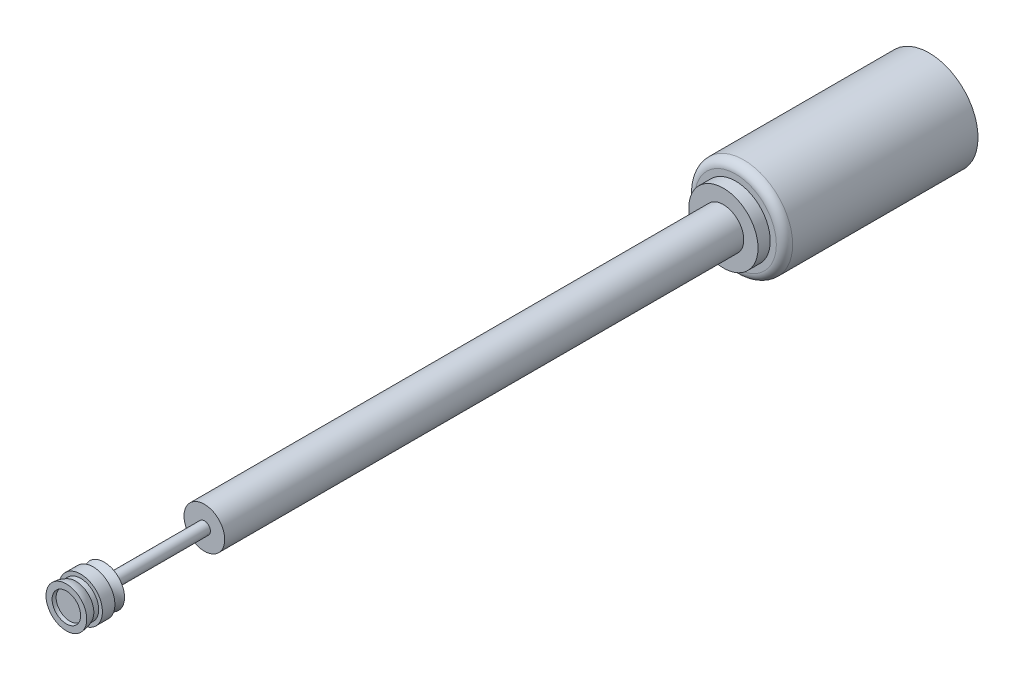
ISO-10303-21;
HEADER;
FILE_DESCRIPTION(('STEP AP214'),'2;1');
FILE_NAME('part.step','',(''),(''),'','','');
FILE_SCHEMA(('AUTOMOTIVE_DESIGN { 1 0 10303 214 1 1 1 1 }'));
ENDSEC;
DATA;
#1=APPLICATION_CONTEXT('core data for automotive mechanical design processes');
#2=APPLICATION_PROTOCOL_DEFINITION('international standard','automotive_design',2000,#1);
#3=PRODUCT_CONTEXT('',#1,'mechanical');
#4=PRODUCT('Part','Part','',(#3));
#5=PRODUCT_RELATED_PRODUCT_CATEGORY('part','',(#4));
#6=PRODUCT_DEFINITION_FORMATION('','',#4);
#7=PRODUCT_DEFINITION_CONTEXT('part definition',#1,'design');
#8=PRODUCT_DEFINITION('design','',#6,#7);
#9=PRODUCT_DEFINITION_SHAPE('','',#8);
#10=(LENGTH_UNIT() NAMED_UNIT(*) SI_UNIT(.MILLI.,.METRE.));
#11=(NAMED_UNIT(*) PLANE_ANGLE_UNIT() SI_UNIT($,.RADIAN.));
#12=(NAMED_UNIT(*) SI_UNIT($,.STERADIAN.) SOLID_ANGLE_UNIT());
#13=UNCERTAINTY_MEASURE_WITH_UNIT(LENGTH_MEASURE(1.E-05),#10,'distance_accuracy_value','');
#14=(GEOMETRIC_REPRESENTATION_CONTEXT(3) GLOBAL_UNCERTAINTY_ASSIGNED_CONTEXT((#13)) GLOBAL_UNIT_ASSIGNED_CONTEXT((#10,
#11,#12)) REPRESENTATION_CONTEXT('',''));
#15=CARTESIAN_POINT('',(0.,0.,0.));
#16=DIRECTION('',(0.,0.,1.));
#17=DIRECTION('',(1.,0.,0.));
#18=AXIS2_PLACEMENT_3D('',#15,#16,#17);
#19=CARTESIAN_POINT('',(0.,0.,16.4275));
#20=DIRECTION('',(0.,0.,-1.));
#21=DIRECTION('',(-1.,0.,0.));
#22=AXIS2_PLACEMENT_3D('',#19,#20,#21);
#23=SPHERICAL_SURFACE('',#22,0.35);
#24=CARTESIAN_POINT('',(0.,0.,16.4275));
#25=DIRECTION('',(0.,0.,-1.));
#26=DIRECTION('',(-1.,0.,0.));
#27=AXIS2_PLACEMENT_3D('',#24,#25,#26);
#28=CIRCLE('',#27,0.35);
#29=CARTESIAN_POINT('',(-0.35,0.,16.4275));
#30=VERTEX_POINT('',#29);
#31=EDGE_CURVE('E87',#30,#30,#28,.T.);
#32=ORIENTED_EDGE('',*,*,#31,.F.);
#33=EDGE_LOOP('',(#32));
#34=FACE_BOUND('',#33,.T.);
#35=CARTESIAN_POINT('',(0.,0.,16.34));
#36=DIRECTION('',(0.,0.,-1.));
#37=DIRECTION('',(-1.,0.,0.));
#38=AXIS2_PLACEMENT_3D('',#35,#36,#37);
#39=CIRCLE('',#38,0.338886042793149);
#40=CARTESIAN_POINT('',(-0.338886042793149,0.,16.34));
#41=VERTEX_POINT('',#40);
#42=EDGE_CURVE('E10',#41,#41,#39,.F.);
#43=ORIENTED_EDGE('',*,*,#42,.F.);
#44=EDGE_LOOP('',(#43));
#45=FACE_BOUND('',#44,.T.);
#46=ADVANCED_FACE('F36',(#34,#45),#23,.F.);
#47=CARTESIAN_POINT('',(0.,0.,15.7709864840342));
#48=DIRECTION('',(0.,0.,-1.));
#49=DIRECTION('',(-1.,0.,0.));
#50=AXIS2_PLACEMENT_3D('',#47,#48,#49);
#51=TOROIDAL_SURFACE('',#50,0.772327550302638,0.384182208311404);
#52=CARTESIAN_POINT('',(0.,0.,15.5));
#53=DIRECTION('',(0.,0.,1.));
#54=DIRECTION('',(1.,0.,0.));
#55=AXIS2_PLACEMENT_3D('',#52,#53,#54);
#56=CIRCLE('',#55,0.499999999999999);
#57=CARTESIAN_POINT('',(0.499999999999999,0.,15.5));
#58=VERTEX_POINT('',#57);
#59=EDGE_CURVE('E90',#58,#58,#56,.F.);
#60=ORIENTED_EDGE('',*,*,#59,.F.);
#61=EDGE_LOOP('',(#60));
#62=FACE_BOUND('',#61,.T.);
#63=CARTESIAN_POINT('',(0.,0.,15.7709864840342));
#64=DIRECTION('',(0.,0.,-1.));
#65=DIRECTION('',(-1.,0.,0.));
#66=AXIS2_PLACEMENT_3D('',#63,#64,#65);
#67=CIRCLE('',#66,0.388145341991233);
#68=CARTESIAN_POINT('',(-0.388145341991233,0.,15.7709864840342));
#69=VERTEX_POINT('',#68);
#70=EDGE_CURVE('E69',#69,#69,#67,.T.);
#71=ORIENTED_EDGE('',*,*,#70,.T.);
#72=EDGE_LOOP('',(#71));
#73=FACE_BOUND('',#72,.T.);
#74=ADVANCED_FACE('F120',(#62,#73),#51,.F.);
#75=CARTESIAN_POINT('',(0.535097448690288,0.,15.7709864840342));
#76=DIRECTION('',(0.,0.,1.));
#77=DIRECTION('',(1.,0.,0.));
#78=AXIS2_PLACEMENT_3D('',#75,#76,#77);
#79=PLANE('',#78);
#80=ORIENTED_EDGE('',*,*,#70,.F.);
#81=EDGE_LOOP('',(#80));
#82=FACE_BOUND('',#81,.T.);
#83=CARTESIAN_POINT('',(0.,0.,15.7709864840342));
#84=DIRECTION('',(0.,0.,-1.));
#85=DIRECTION('',(-1.,0.,0.));
#86=AXIS2_PLACEMENT_3D('',#83,#84,#85);
#87=CIRCLE('',#86,0.535097448690288);
#88=CARTESIAN_POINT('',(-0.535097448690288,0.,15.7709864840342));
#89=VERTEX_POINT('',#88);
#90=EDGE_CURVE('E72',#89,#89,#87,.T.);
#91=ORIENTED_EDGE('',*,*,#90,.T.);
#92=EDGE_LOOP('',(#91));
#93=FACE_BOUND('',#92,.T.);
#94=ADVANCED_FACE('F127',(#82,#93),#79,.F.);
#95=CARTESIAN_POINT('',(0.,0.,15.5));
#96=DIRECTION('',(0.,0.,-1.));
#97=DIRECTION('',(-1.,0.,0.));
#98=AXIS2_PLACEMENT_3D('',#95,#96,#97);
#99=CYLINDRICAL_SURFACE('',#98,0.535097448690288);
#100=ORIENTED_EDGE('',*,*,#90,.F.);
#101=EDGE_LOOP('',(#100));
#102=FACE_BOUND('',#101,.T.);
#103=CARTESIAN_POINT('',(0.,0.,16.0775));
#104=DIRECTION('',(0.,0.,-1.));
#105=DIRECTION('',(-1.,0.,0.));
#106=AXIS2_PLACEMENT_3D('',#103,#104,#105);
#107=CIRCLE('',#106,0.535097448690288);
#108=CARTESIAN_POINT('',(-0.535097448690287,0.,16.0775));
#109=VERTEX_POINT('',#108);
#110=EDGE_CURVE('E75',#109,#109,#107,.T.);
#111=ORIENTED_EDGE('',*,*,#110,.T.);
#112=EDGE_LOOP('',(#111));
#113=FACE_BOUND('',#112,.T.);
#114=ADVANCED_FACE('F171',(#102,#113),#99,.T.);
#115=CARTESIAN_POINT('',(0.443589461196576,0.,16.0775));
#116=DIRECTION('',(0.,0.,-1.));
#117=DIRECTION('',(-1.,0.,0.));
#118=AXIS2_PLACEMENT_3D('',#115,#116,#117);
#119=PLANE('',#118);
#120=ORIENTED_EDGE('',*,*,#110,.F.);
#121=EDGE_LOOP('',(#120));
#122=FACE_BOUND('',#121,.T.);
#123=CARTESIAN_POINT('',(0.,0.,16.0775));
#124=DIRECTION('',(0.,0.,-1.));
#125=DIRECTION('',(-1.,0.,0.));
#126=AXIS2_PLACEMENT_3D('',#123,#124,#125);
#127=CIRCLE('',#126,0.443589461196576);
#128=CARTESIAN_POINT('',(-0.443589461196576,0.,16.0775));
#129=VERTEX_POINT('',#128);
#130=EDGE_CURVE('E78',#129,#129,#127,.T.);
#131=ORIENTED_EDGE('',*,*,#130,.T.);
#132=EDGE_LOOP('',(#131));
#133=FACE_BOUND('',#132,.T.);
#134=ADVANCED_FACE('F167',(#122,#133),#119,.F.);
#135=CARTESIAN_POINT('',(0.,0.,15.5));
#136=DIRECTION('',(0.,0.,-1.));
#137=DIRECTION('',(-1.,0.,0.));
#138=AXIS2_PLACEMENT_3D('',#135,#136,#137);
#139=CYLINDRICAL_SURFACE('',#138,0.443589461196575);
#140=ORIENTED_EDGE('',*,*,#130,.F.);
#141=EDGE_LOOP('',(#140));
#142=FACE_BOUND('',#141,.T.);
#143=CARTESIAN_POINT('',(0.,0.,16.1967872133684));
#144=DIRECTION('',(0.,0.,-1.));
#145=DIRECTION('',(-1.,0.,0.));
#146=AXIS2_PLACEMENT_3D('',#143,#144,#145);
#147=CIRCLE('',#146,0.443589461196575);
#148=CARTESIAN_POINT('',(-0.443589461196575,0.,16.1967872133684));
#149=VERTEX_POINT('',#148);
#150=EDGE_CURVE('E81',#149,#149,#147,.T.);
#151=ORIENTED_EDGE('',*,*,#150,.T.);
#152=EDGE_LOOP('',(#151));
#153=FACE_BOUND('',#152,.T.);
#154=ADVANCED_FACE('F159',(#142,#153),#139,.T.);
#155=CARTESIAN_POINT('',(0.,0.,16.4275));
#156=DIRECTION('',(0.,0.,-1.));
#157=DIRECTION('',(1.,0.,0.));
#158=AXIS2_PLACEMENT_3D('',#155,#156,#157);
#159=SPHERICAL_SURFACE('',#158,0.500000000000001);
#160=ORIENTED_EDGE('',*,*,#150,.F.);
#161=EDGE_LOOP('',(#160));
#162=FACE_BOUND('',#161,.T.);
#163=CARTESIAN_POINT('',(0.,0.,16.4275));
#164=DIRECTION('',(0.,0.,-1.));
#165=DIRECTION('',(-1.,0.,0.));
#166=AXIS2_PLACEMENT_3D('',#163,#164,#165);
#167=CIRCLE('',#166,0.5);
#168=CARTESIAN_POINT('',(-0.5,0.,16.4275));
#169=VERTEX_POINT('',#168);
#170=EDGE_CURVE('E84',#169,#169,#167,.T.);
#171=ORIENTED_EDGE('',*,*,#170,.T.);
#172=EDGE_LOOP('',(#171));
#173=FACE_BOUND('',#172,.T.);
#174=ADVANCED_FACE('F154',(#162,#173),#159,.T.);
#175=CARTESIAN_POINT('',(0.35,0.,16.4275));
#176=DIRECTION('',(0.,0.,-1.));
#177=DIRECTION('',(-1.,0.,0.));
#178=AXIS2_PLACEMENT_3D('',#175,#176,#177);
#179=PLANE('',#178);
#180=ORIENTED_EDGE('',*,*,#170,.F.);
#181=EDGE_LOOP('',(#180));
#182=FACE_BOUND('',#181,.T.);
#183=ORIENTED_EDGE('',*,*,#31,.T.);
#184=EDGE_LOOP('',(#183));
#185=FACE_BOUND('',#184,.T.);
#186=ADVANCED_FACE('F148',(#182,#185),#179,.F.);
#187=CARTESIAN_POINT('',(-0.452177067077045,0.,16.34));
#188=DIRECTION('',(0.,0.,-1.));
#189=DIRECTION('',(-1.,0.,0.));
#190=AXIS2_PLACEMENT_3D('',#187,#188,#189);
#191=PLANE('',#190);
#192=ORIENTED_EDGE('',*,*,#42,.T.);
#193=EDGE_LOOP('',(#192));
#194=FACE_BOUND('',#193,.T.);
#195=ADVANCED_FACE('F146',(#194),#191,.F.);
#196=CARTESIAN_POINT('',(-0.148,0.,13.04));
#197=DIRECTION('',(0.,0.,1.));
#198=DIRECTION('',(1.,0.,0.));
#199=AXIS2_PLACEMENT_3D('',#196,#197,#198);
#200=PLANE('',#199);
#201=CARTESIAN_POINT('',(0.,0.,13.04));
#202=DIRECTION('',(0.,0.,1.));
#203=DIRECTION('',(1.,0.,0.));
#204=AXIS2_PLACEMENT_3D('',#201,#202,#203);
#205=CIRCLE('',#204,0.148);
#206=CARTESIAN_POINT('',(0.147999999999999,0.,13.04));
#207=VERTEX_POINT('',#206);
#208=EDGE_CURVE('E93',#207,#207,#205,.T.);
#209=ORIENTED_EDGE('',*,*,#208,.F.);
#210=EDGE_LOOP('',(#209));
#211=FACE_BOUND('',#210,.T.);
#212=CARTESIAN_POINT('',(0.,0.,13.04));
#213=DIRECTION('',(0.,0.,1.));
#214=DIRECTION('',(1.,0.,0.));
#215=AXIS2_PLACEMENT_3D('',#212,#213,#214);
#216=CIRCLE('',#215,0.5);
#217=CARTESIAN_POINT('',(0.5,0.,13.04));
#218=VERTEX_POINT('',#217);
#219=EDGE_CURVE('E40',#218,#218,#216,.T.);
#220=ORIENTED_EDGE('',*,*,#219,.T.);
#221=EDGE_LOOP('',(#220));
#222=FACE_BOUND('',#221,.T.);
#223=ADVANCED_FACE('F115',(#211,#222),#200,.T.);
#224=CARTESIAN_POINT('',(-0.148,0.,15.5));
#225=DIRECTION('',(0.,0.,-1.));
#226=DIRECTION('',(-1.,0.,0.));
#227=AXIS2_PLACEMENT_3D('',#224,#225,#226);
#228=PLANE('',#227);
#229=CARTESIAN_POINT('',(0.,0.,15.5));
#230=DIRECTION('',(0.,0.,1.));
#231=DIRECTION('',(1.,0.,0.));
#232=AXIS2_PLACEMENT_3D('',#229,#230,#231);
#233=CIRCLE('',#232,0.148);
#234=CARTESIAN_POINT('',(0.148,0.,15.5));
#235=VERTEX_POINT('',#234);
#236=EDGE_CURVE('E96',#235,#235,#233,.T.);
#237=ORIENTED_EDGE('',*,*,#236,.T.);
#238=EDGE_LOOP('',(#237));
#239=FACE_BOUND('',#238,.T.);
#240=ORIENTED_EDGE('',*,*,#59,.T.);
#241=EDGE_LOOP('',(#240));
#242=FACE_BOUND('',#241,.T.);
#243=ADVANCED_FACE('F100',(#239,#242),#228,.T.);
#244=CARTESIAN_POINT('',(0.,0.,16.4275));
#245=DIRECTION('',(0.,0.,1.));
#246=DIRECTION('',(1.,0.,0.));
#247=AXIS2_PLACEMENT_3D('',#244,#245,#246);
#248=CYLINDRICAL_SURFACE('',#247,0.148);
#249=ORIENTED_EDGE('',*,*,#208,.T.);
#250=EDGE_LOOP('',(#249));
#251=FACE_BOUND('',#250,.T.);
#252=ORIENTED_EDGE('',*,*,#236,.F.);
#253=EDGE_LOOP('',(#252));
#254=FACE_BOUND('',#253,.T.);
#255=ADVANCED_FACE('F103',(#251,#254),#248,.T.);
#256=CARTESIAN_POINT('',(0.,0.,-4.75));
#257=DIRECTION('',(0.,0.,1.));
#258=DIRECTION('',(1.,0.,0.));
#259=AXIS2_PLACEMENT_3D('',#256,#257,#258);
#260=PLANE('',#259);
#261=CARTESIAN_POINT('',(0.,0.,-4.75));
#262=DIRECTION('',(0.,0.,1.));
#263=DIRECTION('',(1.,0.,0.));
#264=AXIS2_PLACEMENT_3D('',#261,#262,#263);
#265=CIRCLE('',#264,1.2);
#266=CARTESIAN_POINT('',(1.2,0.,-4.75));
#267=VERTEX_POINT('',#266);
#268=EDGE_CURVE('E66',#267,#267,#265,.T.);
#269=ORIENTED_EDGE('',*,*,#268,.F.);
#270=EDGE_LOOP('',(#269));
#271=FACE_BOUND('',#270,.T.);
#272=ADVANCED_FACE('F105',(#271),#260,.F.);
#273=CARTESIAN_POINT('',(0.,0.,-4.75));
#274=DIRECTION('',(0.,0.,1.));
#275=DIRECTION('',(1.,0.,0.));
#276=AXIS2_PLACEMENT_3D('',#273,#274,#275);
#277=CYLINDRICAL_SURFACE('',#276,1.2);
#278=CARTESIAN_POINT('',(0.,0.,-0.2));
#279=DIRECTION('',(0.,0.,1.));
#280=DIRECTION('',(1.,0.,0.));
#281=AXIS2_PLACEMENT_3D('',#278,#279,#280);
#282=CIRCLE('',#281,1.2);
#283=CARTESIAN_POINT('',(1.2,0.,-0.2));
#284=VERTEX_POINT('',#283);
#285=EDGE_CURVE('E60',#284,#284,#282,.F.);
#286=ORIENTED_EDGE('',*,*,#285,.T.);
#287=EDGE_LOOP('',(#286));
#288=FACE_BOUND('',#287,.T.);
#289=ORIENTED_EDGE('',*,*,#268,.T.);
#290=EDGE_LOOP('',(#289));
#291=FACE_BOUND('',#290,.T.);
#292=ADVANCED_FACE('F112',(#288,#291),#277,.T.);
#293=CARTESIAN_POINT('',(0.,0.,-0.2));
#294=DIRECTION('',(0.,0.,1.));
#295=DIRECTION('',(1.,0.,0.));
#296=AXIS2_PLACEMENT_3D('',#293,#294,#295);
#297=TOROIDAL_SURFACE('',#296,1.,0.2);
#298=ORIENTED_EDGE('',*,*,#285,.F.);
#299=EDGE_LOOP('',(#298));
#300=FACE_BOUND('',#299,.T.);
#301=CARTESIAN_POINT('',(0.,0.,0.));
#302=DIRECTION('',(0.,0.,1.));
#303=DIRECTION('',(1.,0.,0.));
#304=AXIS2_PLACEMENT_3D('',#301,#302,#303);
#305=CIRCLE('',#304,1.);
#306=CARTESIAN_POINT('',(1.,0.,0.));
#307=VERTEX_POINT('',#306);
#308=EDGE_CURVE('E63',#307,#307,#305,.T.);
#309=ORIENTED_EDGE('',*,*,#308,.F.);
#310=EDGE_LOOP('',(#309));
#311=FACE_BOUND('',#310,.T.);
#312=ADVANCED_FACE('F183',(#300,#311),#297,.T.);
#313=CARTESIAN_POINT('',(0.,0.,0.));
#314=DIRECTION('',(0.,0.,1.));
#315=DIRECTION('',(1.,0.,0.));
#316=AXIS2_PLACEMENT_3D('',#313,#314,#315);
#317=PLANE('',#316);
#318=CARTESIAN_POINT('',(0.,0.,0.));
#319=DIRECTION('',(0.,0.,1.));
#320=DIRECTION('',(1.,0.,0.));
#321=AXIS2_PLACEMENT_3D('',#318,#319,#320);
#322=CIRCLE('',#321,0.85);
#323=CARTESIAN_POINT('',(0.85,0.,0.));
#324=VERTEX_POINT('',#323);
#325=EDGE_CURVE('E57',#324,#324,#322,.T.);
#326=ORIENTED_EDGE('',*,*,#325,.F.);
#327=EDGE_LOOP('',(#326));
#328=FACE_BOUND('',#327,.T.);
#329=ORIENTED_EDGE('',*,*,#308,.T.);
#330=EDGE_LOOP('',(#329));
#331=FACE_BOUND('',#330,.T.);
#332=ADVANCED_FACE('F179',(#328,#331),#317,.T.);
#333=CARTESIAN_POINT('',(0.,0.,0.3));
#334=DIRECTION('',(0.,0.,-1.));
#335=DIRECTION('',(-1.,0.,0.));
#336=AXIS2_PLACEMENT_3D('',#333,#334,#335);
#337=CYLINDRICAL_SURFACE('',#336,0.85);
#338=CARTESIAN_POINT('',(0.,0.,0.3));
#339=DIRECTION('',(0.,0.,1.));
#340=DIRECTION('',(1.,0.,0.));
#341=AXIS2_PLACEMENT_3D('',#338,#339,#340);
#342=CIRCLE('',#341,0.85);
#343=CARTESIAN_POINT('',(0.85,0.,0.3));
#344=VERTEX_POINT('',#343);
#345=EDGE_CURVE('E54',#344,#344,#342,.T.);
#346=ORIENTED_EDGE('',*,*,#345,.F.);
#347=EDGE_LOOP('',(#346));
#348=FACE_BOUND('',#347,.T.);
#349=ORIENTED_EDGE('',*,*,#325,.T.);
#350=EDGE_LOOP('',(#349));
#351=FACE_BOUND('',#350,.T.);
#352=ADVANCED_FACE('F182',(#348,#351),#337,.T.);
#353=CARTESIAN_POINT('',(0.,0.,0.3));
#354=DIRECTION('',(0.,0.,1.));
#355=DIRECTION('',(1.,0.,0.));
#356=AXIS2_PLACEMENT_3D('',#353,#354,#355);
#357=PLANE('',#356);
#358=CARTESIAN_POINT('',(0.,0.,0.3));
#359=DIRECTION('',(0.,0.,1.));
#360=DIRECTION('',(1.,0.,0.));
#361=AXIS2_PLACEMENT_3D('',#358,#359,#360);
#362=CIRCLE('',#361,0.5);
#363=CARTESIAN_POINT('',(0.5,0.,0.3));
#364=VERTEX_POINT('',#363);
#365=EDGE_CURVE('E49',#364,#364,#362,.T.);
#366=ORIENTED_EDGE('',*,*,#365,.F.);
#367=EDGE_LOOP('',(#366));
#368=FACE_BOUND('',#367,.T.);
#369=ORIENTED_EDGE('',*,*,#345,.T.);
#370=EDGE_LOOP('',(#369));
#371=FACE_BOUND('',#370,.T.);
#372=ADVANCED_FACE('F191',(#368,#371),#357,.T.);
#373=CARTESIAN_POINT('',(0.,0.,15.5));
#374=DIRECTION('',(0.,0.,-1.));
#375=DIRECTION('',(-1.,0.,0.));
#376=AXIS2_PLACEMENT_3D('',#373,#374,#375);
#377=CYLINDRICAL_SURFACE('',#376,0.5);
#378=ORIENTED_EDGE('',*,*,#365,.T.);
#379=EDGE_LOOP('',(#378));
#380=FACE_BOUND('',#379,.T.);
#381=ORIENTED_EDGE('',*,*,#219,.F.);
#382=EDGE_LOOP('',(#381));
#383=FACE_BOUND('',#382,.T.);
#384=ADVANCED_FACE('F38',(#380,#383),#377,.T.);
#385=CLOSED_SHELL('',(#46,#74,#94,#114,#134,#154,#174,#186,#195,#223,#243,#255,#272,#292,#312,
#332,#352,#372,#384));
#386=CARTESIAN_POINT('',(-0.452177067077045,0.,16.2888119851727));
#387=DIRECTION('',(0.,0.,1.));
#388=DIRECTION('',(1.,0.,0.));
#389=AXIS2_PLACEMENT_3D('',#386,#387,#388);
#390=PLANE('',#389);
#391=CARTESIAN_POINT('',(0.,0.,16.2888119851727));
#392=DIRECTION('',(0.,0.,1.));
#393=DIRECTION('',(1.,0.,0.));
#394=AXIS2_PLACEMENT_3D('',#391,#392,#393);
#395=CIRCLE('',#394,0.321349707551235);
#396=CARTESIAN_POINT('',(0.321349707551235,0.,16.2888119851727));
#397=VERTEX_POINT('',#396);
#398=EDGE_CURVE('E45',#397,#397,#395,.F.);
#399=ORIENTED_EDGE('',*,*,#398,.T.);
#400=EDGE_LOOP('',(#399));
#401=FACE_BOUND('',#400,.T.);
#402=ADVANCED_FACE('F135',(#401),#390,.F.);
#403=ORIENTED_EDGE('',*,*,#398,.F.);
#404=EDGE_LOOP('',(#403));
#405=FACE_BOUND('',#404,.T.);
#406=ADVANCED_FACE('F123',(#405),#23,.F.);
#407=CLOSED_SHELL('',(#402,#406));
#408=ORIENTED_CLOSED_SHELL('',*,#407,.T.);
#409=BREP_WITH_VOIDS('B2',#385,(#408));
#410=ADVANCED_BREP_SHAPE_REPRESENTATION('',(#18,#409),#14);
#411=SHAPE_DEFINITION_REPRESENTATION(#9,#410);
ENDSEC;
END-ISO-10303-21;
